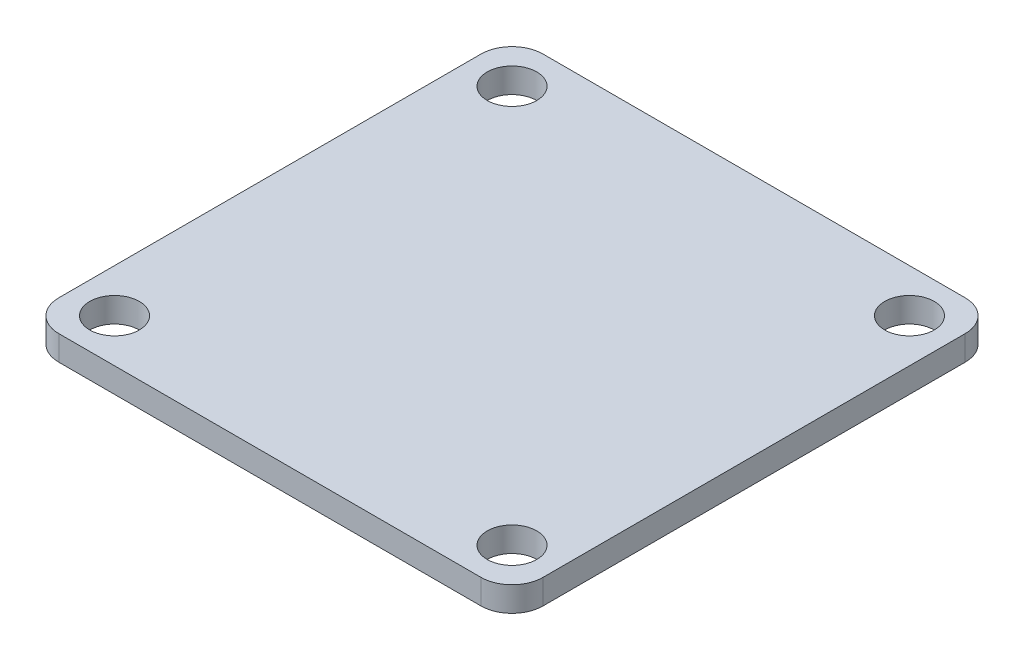
ISO-10303-21;
HEADER;
FILE_DESCRIPTION(('STEP AP214'),'2;1');
FILE_NAME('part.step','',(''),(''),'','','');
FILE_SCHEMA(('AUTOMOTIVE_DESIGN { 1 0 10303 214 1 1 1 1 }'));
ENDSEC;
DATA;
#1=APPLICATION_CONTEXT('core data for automotive mechanical design processes');
#2=APPLICATION_PROTOCOL_DEFINITION('international standard','automotive_design',2000,#1);
#3=PRODUCT_CONTEXT('',#1,'mechanical');
#4=PRODUCT('Part','Part','',(#3));
#5=PRODUCT_RELATED_PRODUCT_CATEGORY('part','',(#4));
#6=PRODUCT_DEFINITION_FORMATION('','',#4);
#7=PRODUCT_DEFINITION_CONTEXT('part definition',#1,'design');
#8=PRODUCT_DEFINITION('design','',#6,#7);
#9=PRODUCT_DEFINITION_SHAPE('','',#8);
#10=(LENGTH_UNIT() NAMED_UNIT(*) SI_UNIT(.MILLI.,.METRE.));
#11=(NAMED_UNIT(*) PLANE_ANGLE_UNIT() SI_UNIT($,.RADIAN.));
#12=(NAMED_UNIT(*) SI_UNIT($,.STERADIAN.) SOLID_ANGLE_UNIT());
#13=UNCERTAINTY_MEASURE_WITH_UNIT(LENGTH_MEASURE(1.E-05),#10,'distance_accuracy_value','');
#14=(GEOMETRIC_REPRESENTATION_CONTEXT(3) GLOBAL_UNCERTAINTY_ASSIGNED_CONTEXT((#13)) GLOBAL_UNIT_ASSIGNED_CONTEXT((#10,
#11,#12)) REPRESENTATION_CONTEXT('',''));
#15=CARTESIAN_POINT('',(0.,0.,0.));
#16=DIRECTION('',(0.,0.,1.));
#17=DIRECTION('',(1.,0.,0.));
#18=AXIS2_PLACEMENT_3D('',#15,#16,#17);
#19=CARTESIAN_POINT('',(68.1421356237309,8.,68.1421356237309));
#20=DIRECTION('',(0.,1.,0.));
#21=DIRECTION('',(0.,0.,1.));
#22=AXIS2_PLACEMENT_3D('',#19,#20,#21);
#23=PLANE('',#22);
#24=CARTESIAN_POINT('',(-64.1421356237199,8.,64.1421356237419));
#25=DIRECTION('',(0.,1.,0.));
#26=DIRECTION('',(0.,0.,1.));
#27=AXIS2_PLACEMENT_3D('',#24,#25,#26);
#28=CIRCLE('',#27,8.00000000000765);
#29=CARTESIAN_POINT('',(-64.1421356237199,8.,72.1421356237496));
#30=VERTEX_POINT('',#29);
#31=EDGE_CURVE('E192',#30,#30,#28,.T.);
#32=ORIENTED_EDGE('',*,*,#31,.F.);
#33=EDGE_LOOP('',(#32));
#34=FACE_BOUND('',#33,.T.);
#35=CARTESIAN_POINT('',(64.142135623731,8.,-64.142135623731));
#36=DIRECTION('',(0.,1.,0.));
#37=DIRECTION('',(0.,0.,1.));
#38=AXIS2_PLACEMENT_3D('',#35,#36,#37);
#39=CIRCLE('',#38,7.99999999999999);
#40=CARTESIAN_POINT('',(64.142135623731,8.,-56.142135623731));
#41=VERTEX_POINT('',#40);
#42=EDGE_CURVE('E138',#41,#41,#39,.T.);
#43=ORIENTED_EDGE('',*,*,#42,.F.);
#44=EDGE_LOOP('',(#43));
#45=FACE_BOUND('',#44,.T.);
#46=CARTESIAN_POINT('',(68.1421356237309,8.,68.1421356237309));
#47=DIRECTION('',(0.,1.,0.));
#48=DIRECTION('',(0.,0.,1.));
#49=AXIS2_PLACEMENT_3D('',#46,#47,#48);
#50=CIRCLE('',#49,9.99999999999999);
#51=CARTESIAN_POINT('',(68.1421356237309,8.,78.1421356237309));
#52=VERTEX_POINT('',#51);
#53=CARTESIAN_POINT('',(78.1421356237309,8.,68.1421356237308));
#54=VERTEX_POINT('',#53);
#55=EDGE_CURVE('E149',#52,#54,#50,.T.);
#56=ORIENTED_EDGE('',*,*,#55,.T.);
#57=DIRECTION('',(0.,0.,-1.));
#58=VECTOR('',#57,1.);
#59=CARTESIAN_POINT('',(78.1421356237309,8.,68.1421356237308));
#60=LINE('',#59,#58);
#61=CARTESIAN_POINT('',(78.1421356237309,8.,-68.142135623731));
#62=VERTEX_POINT('',#61);
#63=EDGE_CURVE('E97',#54,#62,#60,.T.);
#64=ORIENTED_EDGE('',*,*,#63,.T.);
#65=CARTESIAN_POINT('',(68.1421356237309,8.,-68.142135623731));
#66=DIRECTION('',(0.,1.,0.));
#67=DIRECTION('',(0.,0.,1.));
#68=AXIS2_PLACEMENT_3D('',#65,#66,#67);
#69=CIRCLE('',#68,9.99999999999999);
#70=CARTESIAN_POINT('',(68.1421356237309,8.,-78.142135623731));
#71=VERTEX_POINT('',#70);
#72=EDGE_CURVE('E164',#62,#71,#69,.T.);
#73=ORIENTED_EDGE('',*,*,#72,.T.);
#74=DIRECTION('',(-1.,0.,0.));
#75=VECTOR('',#74,1.);
#76=CARTESIAN_POINT('',(-68.1421356237309,8.,-78.142135623731));
#77=LINE('',#76,#75);
#78=CARTESIAN_POINT('',(-68.1421356237309,8.,-78.142135623731));
#79=VERTEX_POINT('',#78);
#80=EDGE_CURVE('E177',#71,#79,#77,.T.);
#81=ORIENTED_EDGE('',*,*,#80,.T.);
#82=CARTESIAN_POINT('',(-68.1421356237309,8.,-68.142135623731));
#83=DIRECTION('',(0.,1.,0.));
#84=DIRECTION('',(0.,0.,-1.));
#85=AXIS2_PLACEMENT_3D('',#82,#83,#84);
#86=CIRCLE('',#85,9.99999999999999);
#87=CARTESIAN_POINT('',(-78.1421356237309,8.,-68.142135623731));
#88=VERTEX_POINT('',#87);
#89=EDGE_CURVE('E116',#79,#88,#86,.T.);
#90=ORIENTED_EDGE('',*,*,#89,.T.);
#91=DIRECTION('',(0.,0.,1.));
#92=VECTOR('',#91,1.);
#93=CARTESIAN_POINT('',(-78.1421356237309,8.,68.1421356237308));
#94=LINE('',#93,#92);
#95=CARTESIAN_POINT('',(-78.1421356237309,8.,68.1421356237308));
#96=VERTEX_POINT('',#95);
#97=EDGE_CURVE('E110',#88,#96,#94,.T.);
#98=ORIENTED_EDGE('',*,*,#97,.T.);
#99=CARTESIAN_POINT('',(-68.1421356237309,8.,68.1421356237309));
#100=DIRECTION('',(0.,1.,0.));
#101=DIRECTION('',(0.,0.,1.));
#102=AXIS2_PLACEMENT_3D('',#99,#100,#101);
#103=CIRCLE('',#102,9.99999999999999);
#104=CARTESIAN_POINT('',(-68.1421356237309,8.,78.1421356237309));
#105=VERTEX_POINT('',#104);
#106=EDGE_CURVE('E114',#96,#105,#103,.T.);
#107=ORIENTED_EDGE('',*,*,#106,.T.);
#108=DIRECTION('',(1.,0.,0.));
#109=VECTOR('',#108,1.);
#110=CARTESIAN_POINT('',(-68.1421356237309,8.,78.1421356237309));
#111=LINE('',#110,#109);
#112=EDGE_CURVE('E54',#105,#52,#111,.T.);
#113=ORIENTED_EDGE('',*,*,#112,.T.);
#114=EDGE_LOOP('',(#56,#64,#73,#81,#90,#98,#107,#113));
#115=FACE_BOUND('',#114,.T.);
#116=CARTESIAN_POINT('',(64.142135623742,8.,64.1421356237309));
#117=DIRECTION('',(0.,1.,0.));
#118=DIRECTION('',(0.,0.,1.));
#119=AXIS2_PLACEMENT_3D('',#116,#117,#118);
#120=CIRCLE('',#119,7.99999999999701);
#121=CARTESIAN_POINT('',(64.142135623742,8.,72.1421356237279));
#122=VERTEX_POINT('',#121);
#123=EDGE_CURVE('E186',#122,#122,#120,.T.);
#124=ORIENTED_EDGE('',*,*,#123,.F.);
#125=EDGE_LOOP('',(#124));
#126=FACE_BOUND('',#125,.T.);
#127=CARTESIAN_POINT('',(-64.142135623731,8.,-64.14213562372));
#128=DIRECTION('',(0.,1.,0.));
#129=DIRECTION('',(0.,0.,1.));
#130=AXIS2_PLACEMENT_3D('',#127,#128,#129);
#131=CIRCLE('',#130,8.00000000001094);
#132=CARTESIAN_POINT('',(-64.142135623731,8.,-56.1421356237091));
#133=VERTEX_POINT('',#132);
#134=EDGE_CURVE('E198',#133,#133,#131,.T.);
#135=ORIENTED_EDGE('',*,*,#134,.F.);
#136=EDGE_LOOP('',(#135));
#137=FACE_BOUND('',#136,.T.);
#138=ADVANCED_FACE('F37',(#34,#45,#115,#126,#137),#23,.T.);
#139=CARTESIAN_POINT('',(68.1421356237309,0.,68.1421356237309));
#140=DIRECTION('',(0.,1.,0.));
#141=DIRECTION('',(0.,0.,1.));
#142=AXIS2_PLACEMENT_3D('',#139,#140,#141);
#143=PLANE('',#142);
#144=CARTESIAN_POINT('',(68.1421356237309,0.,68.1421356237309));
#145=DIRECTION('',(0.,1.,0.));
#146=DIRECTION('',(0.,0.,1.));
#147=AXIS2_PLACEMENT_3D('',#144,#145,#146);
#148=CIRCLE('',#147,9.99999999999999);
#149=CARTESIAN_POINT('',(68.1421356237309,0.,78.1421356237309));
#150=VERTEX_POINT('',#149);
#151=CARTESIAN_POINT('',(78.1421356237309,0.,68.1421356237308));
#152=VERTEX_POINT('',#151);
#153=EDGE_CURVE('E134',#150,#152,#148,.T.);
#154=ORIENTED_EDGE('',*,*,#153,.F.);
#155=DIRECTION('',(1.,0.,0.));
#156=VECTOR('',#155,1.);
#157=CARTESIAN_POINT('',(-68.1421356237309,0.,78.1421356237309));
#158=LINE('',#157,#156);
#159=CARTESIAN_POINT('',(-68.1421356237309,0.,78.1421356237309));
#160=VERTEX_POINT('',#159);
#161=EDGE_CURVE('E89',#160,#150,#158,.T.);
#162=ORIENTED_EDGE('',*,*,#161,.F.);
#163=CARTESIAN_POINT('',(-68.1421356237309,0.,68.1421356237309));
#164=DIRECTION('',(0.,1.,0.));
#165=DIRECTION('',(0.,0.,1.));
#166=AXIS2_PLACEMENT_3D('',#163,#164,#165);
#167=CIRCLE('',#166,9.99999999999999);
#168=CARTESIAN_POINT('',(-78.1421356237309,0.,68.1421356237308));
#169=VERTEX_POINT('',#168);
#170=EDGE_CURVE('E83',#169,#160,#167,.T.);
#171=ORIENTED_EDGE('',*,*,#170,.F.);
#172=DIRECTION('',(0.,0.,1.));
#173=VECTOR('',#172,1.);
#174=CARTESIAN_POINT('',(-78.1421356237309,0.,68.1421356237308));
#175=LINE('',#174,#173);
#176=CARTESIAN_POINT('',(-78.1421356237309,0.,-68.142135623731));
#177=VERTEX_POINT('',#176);
#178=EDGE_CURVE('E124',#177,#169,#175,.T.);
#179=ORIENTED_EDGE('',*,*,#178,.F.);
#180=CARTESIAN_POINT('',(-68.1421356237309,0.,-68.142135623731));
#181=DIRECTION('',(0.,1.,0.));
#182=DIRECTION('',(0.,0.,-1.));
#183=AXIS2_PLACEMENT_3D('',#180,#181,#182);
#184=CIRCLE('',#183,9.99999999999999);
#185=CARTESIAN_POINT('',(-68.1421356237309,0.,-78.142135623731));
#186=VERTEX_POINT('',#185);
#187=EDGE_CURVE('E144',#186,#177,#184,.T.);
#188=ORIENTED_EDGE('',*,*,#187,.F.);
#189=DIRECTION('',(-1.,0.,0.));
#190=VECTOR('',#189,1.);
#191=CARTESIAN_POINT('',(-68.1421356237309,0.,-78.142135623731));
#192=LINE('',#191,#190);
#193=CARTESIAN_POINT('',(68.1421356237309,0.,-78.142135623731));
#194=VERTEX_POINT('',#193);
#195=EDGE_CURVE('E142',#194,#186,#192,.T.);
#196=ORIENTED_EDGE('',*,*,#195,.F.);
#197=CARTESIAN_POINT('',(68.1421356237309,0.,-68.142135623731));
#198=DIRECTION('',(0.,1.,0.));
#199=DIRECTION('',(0.,0.,1.));
#200=AXIS2_PLACEMENT_3D('',#197,#198,#199);
#201=CIRCLE('',#200,9.99999999999999);
#202=CARTESIAN_POINT('',(78.1421356237309,0.,-68.142135623731));
#203=VERTEX_POINT('',#202);
#204=EDGE_CURVE('E140',#203,#194,#201,.T.);
#205=ORIENTED_EDGE('',*,*,#204,.F.);
#206=DIRECTION('',(0.,0.,-1.));
#207=VECTOR('',#206,1.);
#208=CARTESIAN_POINT('',(78.1421356237309,0.,68.1421356237308));
#209=LINE('',#208,#207);
#210=EDGE_CURVE('E137',#152,#203,#209,.T.);
#211=ORIENTED_EDGE('',*,*,#210,.F.);
#212=EDGE_LOOP('',(#154,#162,#171,#179,#188,#196,#205,#211));
#213=FACE_BOUND('',#212,.T.);
#214=CARTESIAN_POINT('',(64.142135623731,0.,-64.142135623731));
#215=DIRECTION('',(0.,1.,0.));
#216=DIRECTION('',(0.,0.,1.));
#217=AXIS2_PLACEMENT_3D('',#214,#215,#216);
#218=CIRCLE('',#217,7.99999999999999);
#219=CARTESIAN_POINT('',(64.142135623731,0.,-56.142135623731));
#220=VERTEX_POINT('',#219);
#221=EDGE_CURVE('E183',#220,#220,#218,.T.);
#222=ORIENTED_EDGE('',*,*,#221,.T.);
#223=EDGE_LOOP('',(#222));
#224=FACE_BOUND('',#223,.T.);
#225=CARTESIAN_POINT('',(64.142135623742,0.,64.1421356237309));
#226=DIRECTION('',(0.,1.,0.));
#227=DIRECTION('',(0.,0.,1.));
#228=AXIS2_PLACEMENT_3D('',#225,#226,#227);
#229=CIRCLE('',#228,7.99999999999701);
#230=CARTESIAN_POINT('',(64.142135623742,0.,72.1421356237279));
#231=VERTEX_POINT('',#230);
#232=EDGE_CURVE('E189',#231,#231,#229,.T.);
#233=ORIENTED_EDGE('',*,*,#232,.T.);
#234=EDGE_LOOP('',(#233));
#235=FACE_BOUND('',#234,.T.);
#236=CARTESIAN_POINT('',(-64.1421356237199,0.,64.1421356237419));
#237=DIRECTION('',(0.,1.,0.));
#238=DIRECTION('',(0.,0.,1.));
#239=AXIS2_PLACEMENT_3D('',#236,#237,#238);
#240=CIRCLE('',#239,8.00000000000765);
#241=CARTESIAN_POINT('',(-64.1421356237199,0.,72.1421356237496));
#242=VERTEX_POINT('',#241);
#243=EDGE_CURVE('E195',#242,#242,#240,.T.);
#244=ORIENTED_EDGE('',*,*,#243,.T.);
#245=EDGE_LOOP('',(#244));
#246=FACE_BOUND('',#245,.T.);
#247=CARTESIAN_POINT('',(-64.142135623731,0.,-64.14213562372));
#248=DIRECTION('',(0.,1.,0.));
#249=DIRECTION('',(0.,0.,1.));
#250=AXIS2_PLACEMENT_3D('',#247,#248,#249);
#251=CIRCLE('',#250,8.00000000001094);
#252=CARTESIAN_POINT('',(-64.142135623731,0.,-56.1421356237091));
#253=VERTEX_POINT('',#252);
#254=EDGE_CURVE('E201',#253,#253,#251,.T.);
#255=ORIENTED_EDGE('',*,*,#254,.T.);
#256=EDGE_LOOP('',(#255));
#257=FACE_BOUND('',#256,.T.);
#258=ADVANCED_FACE('F168',(#213,#224,#235,#246,#257),#143,.F.);
#259=CARTESIAN_POINT('',(68.1421356237309,8.,68.1421356237309));
#260=DIRECTION('',(0.,-1.,0.));
#261=DIRECTION('',(0.,0.,-1.));
#262=AXIS2_PLACEMENT_3D('',#259,#260,#261);
#263=CYLINDRICAL_SURFACE('',#262,9.99999999999999);
#264=ORIENTED_EDGE('',*,*,#153,.T.);
#265=DIRECTION('',(0.,-1.,0.));
#266=VECTOR('',#265,1.);
#267=CARTESIAN_POINT('',(78.1421356237309,8.,68.1421356237308));
#268=LINE('',#267,#266);
#269=EDGE_CURVE('E11',#54,#152,#268,.T.);
#270=ORIENTED_EDGE('',*,*,#269,.F.);
#271=ORIENTED_EDGE('',*,*,#55,.F.);
#272=DIRECTION('',(0.,-1.,0.));
#273=VECTOR('',#272,1.);
#274=CARTESIAN_POINT('',(68.1421356237309,8.,78.1421356237309));
#275=LINE('',#274,#273);
#276=EDGE_CURVE('E130',#52,#150,#275,.T.);
#277=ORIENTED_EDGE('',*,*,#276,.T.);
#278=EDGE_LOOP('',(#264,#270,#271,#277));
#279=FACE_BOUND('',#278,.T.);
#280=ADVANCED_FACE('F39',(#279),#263,.T.);
#281=CARTESIAN_POINT('',(78.1421356237309,8.,68.1421356237308));
#282=DIRECTION('',(-1.,0.,0.));
#283=DIRECTION('',(0.,0.,1.));
#284=AXIS2_PLACEMENT_3D('',#281,#282,#283);
#285=PLANE('',#284);
#286=ORIENTED_EDGE('',*,*,#210,.T.);
#287=DIRECTION('',(0.,-1.,0.));
#288=VECTOR('',#287,1.);
#289=CARTESIAN_POINT('',(78.1421356237309,8.,-68.142135623731));
#290=LINE('',#289,#288);
#291=EDGE_CURVE('E46',#62,#203,#290,.T.);
#292=ORIENTED_EDGE('',*,*,#291,.F.);
#293=ORIENTED_EDGE('',*,*,#63,.F.);
#294=ORIENTED_EDGE('',*,*,#269,.T.);
#295=EDGE_LOOP('',(#286,#292,#293,#294));
#296=FACE_BOUND('',#295,.T.);
#297=ADVANCED_FACE('F235',(#296),#285,.F.);
#298=CARTESIAN_POINT('',(68.1421356237309,8.,-68.142135623731));
#299=DIRECTION('',(0.,-1.,0.));
#300=DIRECTION('',(0.,0.,-1.));
#301=AXIS2_PLACEMENT_3D('',#298,#299,#300);
#302=CYLINDRICAL_SURFACE('',#301,9.99999999999999);
#303=ORIENTED_EDGE('',*,*,#204,.T.);
#304=DIRECTION('',(0.,-1.,0.));
#305=VECTOR('',#304,1.);
#306=CARTESIAN_POINT('',(68.1421356237309,8.,-78.142135623731));
#307=LINE('',#306,#305);
#308=EDGE_CURVE('E156',#71,#194,#307,.T.);
#309=ORIENTED_EDGE('',*,*,#308,.F.);
#310=ORIENTED_EDGE('',*,*,#72,.F.);
#311=ORIENTED_EDGE('',*,*,#291,.T.);
#312=EDGE_LOOP('',(#303,#309,#310,#311));
#313=FACE_BOUND('',#312,.T.);
#314=ADVANCED_FACE('F162',(#313),#302,.T.);
#315=CARTESIAN_POINT('',(-68.1421356237309,8.,-78.142135623731));
#316=DIRECTION('',(0.,0.,1.));
#317=DIRECTION('',(1.,0.,0.));
#318=AXIS2_PLACEMENT_3D('',#315,#316,#317);
#319=PLANE('',#318);
#320=ORIENTED_EDGE('',*,*,#195,.T.);
#321=DIRECTION('',(0.,-1.,0.));
#322=VECTOR('',#321,1.);
#323=CARTESIAN_POINT('',(-68.1421356237309,8.,-78.142135623731));
#324=LINE('',#323,#322);
#325=EDGE_CURVE('E153',#79,#186,#324,.T.);
#326=ORIENTED_EDGE('',*,*,#325,.F.);
#327=ORIENTED_EDGE('',*,*,#80,.F.);
#328=ORIENTED_EDGE('',*,*,#308,.T.);
#329=EDGE_LOOP('',(#320,#326,#327,#328));
#330=FACE_BOUND('',#329,.T.);
#331=ADVANCED_FACE('F173',(#330),#319,.F.);
#332=CARTESIAN_POINT('',(-68.1421356237309,8.,-68.142135623731));
#333=DIRECTION('',(0.,-1.,0.));
#334=DIRECTION('',(0.,0.,-1.));
#335=AXIS2_PLACEMENT_3D('',#332,#333,#334);
#336=CYLINDRICAL_SURFACE('',#335,9.99999999999999);
#337=ORIENTED_EDGE('',*,*,#187,.T.);
#338=DIRECTION('',(0.,-1.,0.));
#339=VECTOR('',#338,1.);
#340=CARTESIAN_POINT('',(-78.1421356237309,8.,-68.142135623731));
#341=LINE('',#340,#339);
#342=EDGE_CURVE('E125',#88,#177,#341,.T.);
#343=ORIENTED_EDGE('',*,*,#342,.F.);
#344=ORIENTED_EDGE('',*,*,#89,.F.);
#345=ORIENTED_EDGE('',*,*,#325,.T.);
#346=EDGE_LOOP('',(#337,#343,#344,#345));
#347=FACE_BOUND('',#346,.T.);
#348=ADVANCED_FACE('F176',(#347),#336,.T.);
#349=CARTESIAN_POINT('',(-78.1421356237309,8.,68.1421356237308));
#350=DIRECTION('',(1.,0.,0.));
#351=DIRECTION('',(0.,0.,-1.));
#352=AXIS2_PLACEMENT_3D('',#349,#350,#351);
#353=PLANE('',#352);
#354=ORIENTED_EDGE('',*,*,#178,.T.);
#355=DIRECTION('',(0.,-1.,0.));
#356=VECTOR('',#355,1.);
#357=CARTESIAN_POINT('',(-78.1421356237309,8.,68.1421356237308));
#358=LINE('',#357,#356);
#359=EDGE_CURVE('E121',#96,#169,#358,.T.);
#360=ORIENTED_EDGE('',*,*,#359,.F.);
#361=ORIENTED_EDGE('',*,*,#97,.F.);
#362=ORIENTED_EDGE('',*,*,#342,.T.);
#363=EDGE_LOOP('',(#354,#360,#361,#362));
#364=FACE_BOUND('',#363,.T.);
#365=ADVANCED_FACE('F122',(#364),#353,.F.);
#366=CARTESIAN_POINT('',(-68.1421356237309,8.,68.1421356237309));
#367=DIRECTION('',(0.,-1.,0.));
#368=DIRECTION('',(0.,0.,-1.));
#369=AXIS2_PLACEMENT_3D('',#366,#367,#368);
#370=CYLINDRICAL_SURFACE('',#369,9.99999999999999);
#371=ORIENTED_EDGE('',*,*,#170,.T.);
#372=DIRECTION('',(0.,-1.,0.));
#373=VECTOR('',#372,1.);
#374=CARTESIAN_POINT('',(-68.1421356237309,8.,78.1421356237309));
#375=LINE('',#374,#373);
#376=EDGE_CURVE('E126',#105,#160,#375,.T.);
#377=ORIENTED_EDGE('',*,*,#376,.F.);
#378=ORIENTED_EDGE('',*,*,#106,.F.);
#379=ORIENTED_EDGE('',*,*,#359,.T.);
#380=EDGE_LOOP('',(#371,#377,#378,#379));
#381=FACE_BOUND('',#380,.T.);
#382=ADVANCED_FACE('F128',(#381),#370,.T.);
#383=CARTESIAN_POINT('',(-68.1421356237309,8.,78.1421356237309));
#384=DIRECTION('',(0.,0.,-1.));
#385=DIRECTION('',(-1.,0.,0.));
#386=AXIS2_PLACEMENT_3D('',#383,#384,#385);
#387=PLANE('',#386);
#388=ORIENTED_EDGE('',*,*,#161,.T.);
#389=ORIENTED_EDGE('',*,*,#276,.F.);
#390=ORIENTED_EDGE('',*,*,#112,.F.);
#391=ORIENTED_EDGE('',*,*,#376,.T.);
#392=EDGE_LOOP('',(#388,#389,#390,#391));
#393=FACE_BOUND('',#392,.T.);
#394=ADVANCED_FACE('F223',(#393),#387,.F.);
#395=CARTESIAN_POINT('',(64.142135623731,8.,-64.142135623731));
#396=DIRECTION('',(0.,-1.,0.));
#397=DIRECTION('',(0.,0.,-1.));
#398=AXIS2_PLACEMENT_3D('',#395,#396,#397);
#399=CYLINDRICAL_SURFACE('',#398,7.99999999999999);
#400=ORIENTED_EDGE('',*,*,#42,.T.);
#401=EDGE_LOOP('',(#400));
#402=FACE_BOUND('',#401,.T.);
#403=ORIENTED_EDGE('',*,*,#221,.F.);
#404=EDGE_LOOP('',(#403));
#405=FACE_BOUND('',#404,.T.);
#406=ADVANCED_FACE('F220',(#402,#405),#399,.F.);
#407=CARTESIAN_POINT('',(64.142135623742,8.,64.1421356237309));
#408=DIRECTION('',(0.,-1.,0.));
#409=DIRECTION('',(0.,0.,-1.));
#410=AXIS2_PLACEMENT_3D('',#407,#408,#409);
#411=CYLINDRICAL_SURFACE('',#410,7.99999999999701);
#412=ORIENTED_EDGE('',*,*,#123,.T.);
#413=EDGE_LOOP('',(#412));
#414=FACE_BOUND('',#413,.T.);
#415=ORIENTED_EDGE('',*,*,#232,.F.);
#416=EDGE_LOOP('',(#415));
#417=FACE_BOUND('',#416,.T.);
#418=ADVANCED_FACE('F311',(#414,#417),#411,.F.);
#419=CARTESIAN_POINT('',(-64.1421356237199,8.,64.1421356237419));
#420=DIRECTION('',(0.,-1.,0.));
#421=DIRECTION('',(0.,0.,-1.));
#422=AXIS2_PLACEMENT_3D('',#419,#420,#421);
#423=CYLINDRICAL_SURFACE('',#422,8.00000000000765);
#424=ORIENTED_EDGE('',*,*,#31,.T.);
#425=EDGE_LOOP('',(#424));
#426=FACE_BOUND('',#425,.T.);
#427=ORIENTED_EDGE('',*,*,#243,.F.);
#428=EDGE_LOOP('',(#427));
#429=FACE_BOUND('',#428,.T.);
#430=ADVANCED_FACE('F320',(#426,#429),#423,.F.);
#431=CARTESIAN_POINT('',(-64.142135623731,8.,-64.14213562372));
#432=DIRECTION('',(0.,-1.,0.));
#433=DIRECTION('',(0.,0.,-1.));
#434=AXIS2_PLACEMENT_3D('',#431,#432,#433);
#435=CYLINDRICAL_SURFACE('',#434,8.00000000001094);
#436=ORIENTED_EDGE('',*,*,#134,.T.);
#437=EDGE_LOOP('',(#436));
#438=FACE_BOUND('',#437,.T.);
#439=ORIENTED_EDGE('',*,*,#254,.F.);
#440=EDGE_LOOP('',(#439));
#441=FACE_BOUND('',#440,.T.);
#442=ADVANCED_FACE('F207',(#438,#441),#435,.F.);
#443=CLOSED_SHELL('',(#138,#258,#280,#297,#314,#331,#348,#365,#382,#394,#406,#418,#430,#442));
#444=MANIFOLD_SOLID_BREP('B2',#443);
#445=ADVANCED_BREP_SHAPE_REPRESENTATION('',(#18,#444),#14);
#446=SHAPE_DEFINITION_REPRESENTATION(#9,#445);
ENDSEC;
END-ISO-10303-21;
